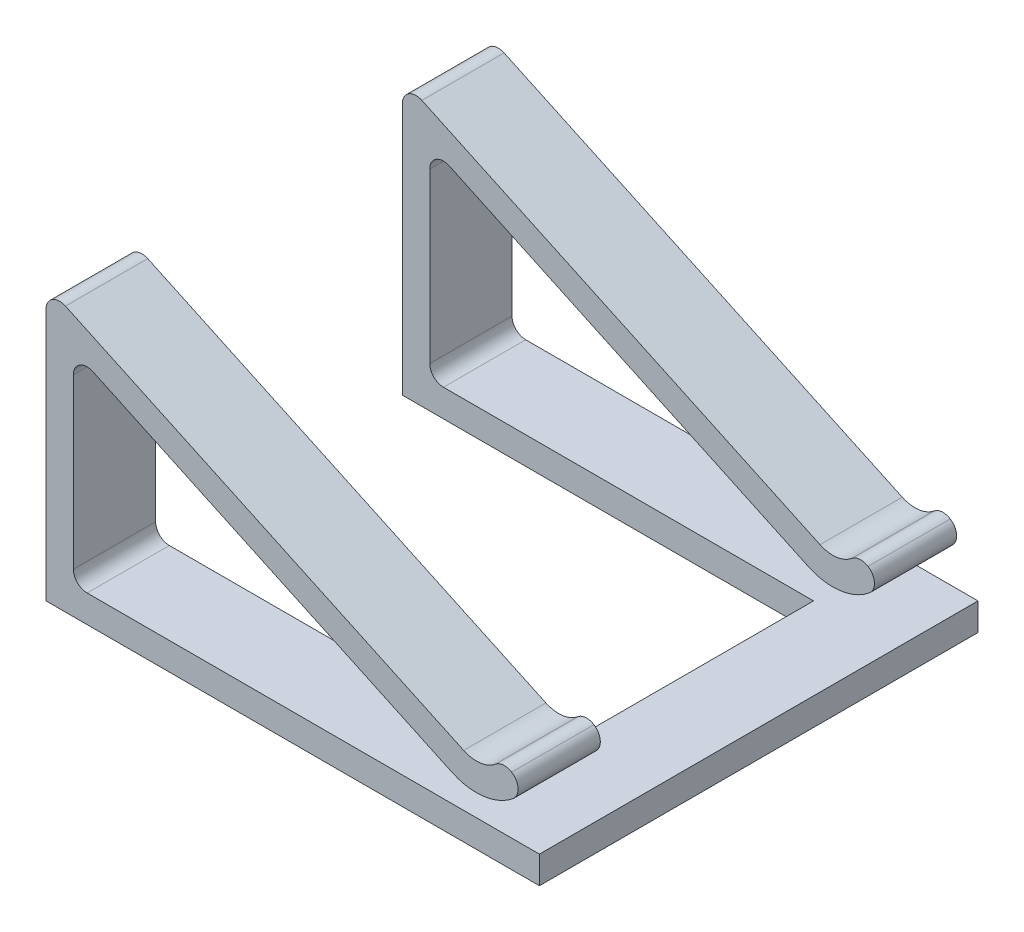
ISO-10303-21;
HEADER;
FILE_DESCRIPTION(('STEP AP214'),'2;1');
FILE_NAME('part.step','',(''),(''),'','','');
FILE_SCHEMA(('AUTOMOTIVE_DESIGN { 1 0 10303 214 1 1 1 1 }'));
ENDSEC;
DATA;
#1=APPLICATION_CONTEXT('core data for automotive mechanical design processes');
#2=APPLICATION_PROTOCOL_DEFINITION('international standard','automotive_design',2000,#1);
#3=PRODUCT_CONTEXT('',#1,'mechanical');
#4=PRODUCT('Part','Part','',(#3));
#5=PRODUCT_RELATED_PRODUCT_CATEGORY('part','',(#4));
#6=PRODUCT_DEFINITION_FORMATION('','',#4);
#7=PRODUCT_DEFINITION_CONTEXT('part definition',#1,'design');
#8=PRODUCT_DEFINITION('design','',#6,#7);
#9=PRODUCT_DEFINITION_SHAPE('','',#8);
#10=(LENGTH_UNIT() NAMED_UNIT(*) SI_UNIT(.MILLI.,.METRE.));
#11=(NAMED_UNIT(*) PLANE_ANGLE_UNIT() SI_UNIT($,.RADIAN.));
#12=(NAMED_UNIT(*) SI_UNIT($,.STERADIAN.) SOLID_ANGLE_UNIT());
#13=UNCERTAINTY_MEASURE_WITH_UNIT(LENGTH_MEASURE(1.E-05),#10,'distance_accuracy_value','');
#14=(GEOMETRIC_REPRESENTATION_CONTEXT(3) GLOBAL_UNCERTAINTY_ASSIGNED_CONTEXT((#13)) GLOBAL_UNIT_ASSIGNED_CONTEXT((#10,
#11,#12)) REPRESENTATION_CONTEXT('',''));
#15=CARTESIAN_POINT('',(0.,0.,0.));
#16=DIRECTION('',(0.,0.,1.));
#17=DIRECTION('',(1.,0.,0.));
#18=AXIS2_PLACEMENT_3D('',#15,#16,#17);
#19=CARTESIAN_POINT('',(150.,10.,-145.));
#20=DIRECTION('',(-1.,0.,0.));
#21=DIRECTION('',(0.,0.,1.));
#22=AXIS2_PLACEMENT_3D('',#19,#20,#21);
#23=PLANE('',#22);
#24=DIRECTION('',(0.,0.,1.));
#25=VECTOR('',#24,1.);
#26=CARTESIAN_POINT('',(150.,10.,-145.));
#27=LINE('',#26,#25);
#28=CARTESIAN_POINT('',(150.,10.,-115.));
#29=VERTEX_POINT('',#28);
#30=CARTESIAN_POINT('',(150.,10.,-15.));
#31=VERTEX_POINT('',#30);
#32=EDGE_CURVE('E327',#29,#31,#27,.T.);
#33=ORIENTED_EDGE('',*,*,#32,.F.);
#34=DIRECTION('',(0.,-1.,0.));
#35=VECTOR('',#34,1.);
#36=CARTESIAN_POINT('',(150.,10.,-115.));
#37=LINE('',#36,#35);
#38=CARTESIAN_POINT('',(150.,0.,-115.));
#39=VERTEX_POINT('',#38);
#40=EDGE_CURVE('E298',#29,#39,#37,.T.);
#41=ORIENTED_EDGE('',*,*,#40,.T.);
#42=DIRECTION('',(0.,0.,1.));
#43=VECTOR('',#42,1.);
#44=CARTESIAN_POINT('',(150.,0.,-145.));
#45=LINE('',#44,#43);
#46=CARTESIAN_POINT('',(150.,0.,-15.));
#47=VERTEX_POINT('',#46);
#48=EDGE_CURVE('E329',#39,#47,#45,.T.);
#49=ORIENTED_EDGE('',*,*,#48,.T.);
#50=DIRECTION('',(0.,-1.,0.));
#51=VECTOR('',#50,1.);
#52=CARTESIAN_POINT('',(150.,10.,-15.));
#53=LINE('',#52,#51);
#54=EDGE_CURVE('E393',#31,#47,#53,.T.);
#55=ORIENTED_EDGE('',*,*,#54,.F.);
#56=EDGE_LOOP('',(#33,#41,#49,#55));
#57=FACE_BOUND('',#56,.T.);
#58=ADVANCED_FACE('F42',(#57),#23,.T.);
#59=CARTESIAN_POINT('',(157.018492499117,38.9182315842951,15.));
#60=DIRECTION('',(0.,0.,-1.));
#61=DIRECTION('',(-1.,0.,0.));
#62=AXIS2_PLACEMENT_3D('',#59,#60,#61);
#63=CYLINDRICAL_SURFACE('',#62,21.);
#64=CARTESIAN_POINT('',(157.018492499117,38.9182315842951,-15.));
#65=DIRECTION('',(0.,0.,1.));
#66=DIRECTION('',(1.,0.,0.));
#67=AXIS2_PLACEMENT_3D('',#64,#65,#66);
#68=CIRCLE('',#67,21.);
#69=CARTESIAN_POINT('',(148.143509002562,19.8857680565255,-15.));
#70=VERTEX_POINT('',#69);
#71=CARTESIAN_POINT('',(170.412592532254,22.7442375104022,-15.));
#72=VERTEX_POINT('',#71);
#73=EDGE_CURVE('E332',#70,#72,#68,.T.);
#74=ORIENTED_EDGE('',*,*,#73,.T.);
#75=DIRECTION('',(0.,0.,-1.));
#76=VECTOR('',#75,1.);
#77=CARTESIAN_POINT('',(170.412592532254,22.7442375104022,15.));
#78=LINE('',#77,#76);
#79=CARTESIAN_POINT('',(170.412592532254,22.7442375104022,15.));
#80=VERTEX_POINT('',#79);
#81=EDGE_CURVE('E494',#72,#80,#78,.F.);
#82=ORIENTED_EDGE('',*,*,#81,.T.);
#83=CARTESIAN_POINT('',(157.018492499117,38.9182315842951,15.));
#84=DIRECTION('',(0.,0.,1.));
#85=DIRECTION('',(1.,0.,0.));
#86=AXIS2_PLACEMENT_3D('',#83,#84,#85);
#87=CIRCLE('',#86,21.);
#88=CARTESIAN_POINT('',(148.143509002562,19.8857680565255,15.));
#89=VERTEX_POINT('',#88);
#90=EDGE_CURVE('E345',#89,#80,#87,.T.);
#91=ORIENTED_EDGE('',*,*,#90,.F.);
#92=DIRECTION('',(0.,0.,-1.));
#93=VECTOR('',#92,1.);
#94=CARTESIAN_POINT('',(148.143509002562,19.8857680565255,15.));
#95=LINE('',#94,#93);
#96=EDGE_CURVE('E374',#89,#70,#95,.T.);
#97=ORIENTED_EDGE('',*,*,#96,.T.);
#98=EDGE_LOOP('',(#74,#82,#91,#97));
#99=FACE_BOUND('',#98,.T.);
#100=ADVANCED_FACE('F599',(#99),#63,.T.);
#101=CARTESIAN_POINT('',(157.018492499117,38.9182315842951,15.));
#102=DIRECTION('',(0.,0.,-1.));
#103=DIRECTION('',(-1.,0.,0.));
#104=AXIS2_PLACEMENT_3D('',#101,#102,#103);
#105=CYLINDRICAL_SURFACE('',#104,11.);
#106=CARTESIAN_POINT('',(157.018492499117,38.9182315842951,15.));
#107=DIRECTION('',(0.,0.,1.));
#108=DIRECTION('',(1.,0.,0.));
#109=AXIS2_PLACEMENT_3D('',#106,#107,#108);
#110=CIRCLE('',#109,11.);
#111=CARTESIAN_POINT('',(152.369691619969,28.948845926892,15.));
#112=VERTEX_POINT('',#111);
#113=CARTESIAN_POINT('',(164.034449659331,30.4461394503512,15.));
#114=VERTEX_POINT('',#113);
#115=EDGE_CURVE('E350',#112,#114,#110,.T.);
#116=ORIENTED_EDGE('',*,*,#115,.T.);
#117=DIRECTION('',(0.,0.,-1.));
#118=VECTOR('',#117,1.);
#119=CARTESIAN_POINT('',(164.034449659331,30.4461394503512,15.));
#120=LINE('',#119,#118);
#121=CARTESIAN_POINT('',(164.034449659331,30.4461394503512,-15.));
#122=VERTEX_POINT('',#121);
#123=EDGE_CURVE('E498',#114,#122,#120,.T.);
#124=ORIENTED_EDGE('',*,*,#123,.T.);
#125=CARTESIAN_POINT('',(157.018492499117,38.9182315842951,-15.));
#126=DIRECTION('',(0.,0.,1.));
#127=DIRECTION('',(1.,0.,0.));
#128=AXIS2_PLACEMENT_3D('',#125,#126,#127);
#129=CIRCLE('',#128,11.);
#130=CARTESIAN_POINT('',(152.369691619969,28.948845926892,-15.));
#131=VERTEX_POINT('',#130);
#132=EDGE_CURVE('E378',#131,#122,#129,.T.);
#133=ORIENTED_EDGE('',*,*,#132,.F.);
#134=DIRECTION('',(0.,0.,-1.));
#135=VECTOR('',#134,1.);
#136=CARTESIAN_POINT('',(152.369691619969,28.948845926892,15.));
#137=LINE('',#136,#135);
#138=EDGE_CURVE('E413',#112,#131,#137,.T.);
#139=ORIENTED_EDGE('',*,*,#138,.F.);
#140=EDGE_LOOP('',(#116,#124,#133,#139));
#141=FACE_BOUND('',#140,.T.);
#142=ADVANCED_FACE('F547',(#141),#105,.F.);
#143=CARTESIAN_POINT('',(0.,100.,15.));
#144=DIRECTION('',(0.422618261740704,0.906307787036648,0.));
#145=DIRECTION('',(-0.906307787036648,0.422618261740704,0.));
#146=AXIS2_PLACEMENT_3D('',#143,#144,#145);
#147=PLANE('',#146);
#148=DIRECTION('',(0.906307787036648,-0.422618261740704,0.));
#149=VECTOR('',#148,1.);
#150=CARTESIAN_POINT('',(0.,100.,-15.));
#151=LINE('',#150,#149);
#152=CARTESIAN_POINT('',(7.11309130870351,96.6831110495958,-15.));
#153=VERTEX_POINT('',#152);
#154=EDGE_CURVE('E384',#153,#131,#151,.T.);
#155=ORIENTED_EDGE('',*,*,#154,.F.);
#156=DIRECTION('',(0.,0.,-1.));
#157=VECTOR('',#156,1.);
#158=CARTESIAN_POINT('',(7.11309130870351,96.6831110495958,15.));
#159=LINE('',#158,#157);
#160=CARTESIAN_POINT('',(7.11309130870351,96.6831110495958,15.));
#161=VERTEX_POINT('',#160);
#162=EDGE_CURVE('E431',#153,#161,#159,.F.);
#163=ORIENTED_EDGE('',*,*,#162,.T.);
#164=DIRECTION('',(0.906307787036648,-0.422618261740704,0.));
#165=VECTOR('',#164,1.);
#166=CARTESIAN_POINT('',(0.,100.,15.));
#167=LINE('',#166,#165);
#168=EDGE_CURVE('E352',#161,#112,#167,.T.);
#169=ORIENTED_EDGE('',*,*,#168,.T.);
#170=ORIENTED_EDGE('',*,*,#138,.T.);
#171=EDGE_LOOP('',(#155,#163,#169,#170));
#172=FACE_BOUND('',#171,.T.);
#173=ADVANCED_FACE('F552',(#172),#147,.T.);
#174=CARTESIAN_POINT('',(0.,0.,15.));
#175=DIRECTION('',(-1.,0.,0.));
#176=DIRECTION('',(0.,0.,1.));
#177=AXIS2_PLACEMENT_3D('',#174,#175,#176);
#178=PLANE('',#177);
#179=DIRECTION('',(0.,1.,0.));
#180=VECTOR('',#179,1.);
#181=CARTESIAN_POINT('',(0.,0.,15.));
#182=LINE('',#181,#180);
#183=CARTESIAN_POINT('',(0.,0.,15.));
#184=VERTEX_POINT('',#183);
#185=CARTESIAN_POINT('',(0.,92.1515721144125,15.));
#186=VERTEX_POINT('',#185);
#187=EDGE_CURVE('E358',#184,#186,#182,.T.);
#188=ORIENTED_EDGE('',*,*,#187,.T.);
#189=DIRECTION('',(0.,0.,-1.));
#190=VECTOR('',#189,1.);
#191=CARTESIAN_POINT('',(0.,92.1515721144125,15.));
#192=LINE('',#191,#190);
#193=CARTESIAN_POINT('',(0.,92.1515721144125,-15.));
#194=VERTEX_POINT('',#193);
#195=EDGE_CURVE('E417',#186,#194,#192,.T.);
#196=ORIENTED_EDGE('',*,*,#195,.T.);
#197=DIRECTION('',(0.,1.,0.));
#198=VECTOR('',#197,1.);
#199=CARTESIAN_POINT('',(0.,0.,-15.));
#200=LINE('',#199,#198);
#201=CARTESIAN_POINT('',(0.,0.,-15.));
#202=VERTEX_POINT('',#201);
#203=EDGE_CURVE('E388',#202,#194,#200,.T.);
#204=ORIENTED_EDGE('',*,*,#203,.F.);
#205=DIRECTION('',(0.,0.,-1.));
#206=VECTOR('',#205,1.);
#207=CARTESIAN_POINT('',(0.,0.,15.));
#208=LINE('',#207,#206);
#209=EDGE_CURVE('E414',#184,#202,#208,.T.);
#210=ORIENTED_EDGE('',*,*,#209,.F.);
#211=EDGE_LOOP('',(#188,#196,#204,#210));
#212=FACE_BOUND('',#211,.T.);
#213=ADVANCED_FACE('F561',(#212),#178,.T.);
#214=CARTESIAN_POINT('',(0.,0.,15.));
#215=DIRECTION('',(0.,-1.,0.));
#216=DIRECTION('',(0.,0.,-1.));
#217=AXIS2_PLACEMENT_3D('',#214,#215,#216);
#218=PLANE('',#217);
#219=DIRECTION('',(-1.,0.,0.));
#220=VECTOR('',#219,1.);
#221=CARTESIAN_POINT('',(0.,0.,-15.));
#222=LINE('',#221,#220);
#223=EDGE_CURVE('E386',#47,#202,#222,.T.);
#224=ORIENTED_EDGE('',*,*,#223,.F.);
#225=ORIENTED_EDGE('',*,*,#48,.F.);
#226=DIRECTION('',(-1.,0.,0.));
#227=VECTOR('',#226,1.);
#228=CARTESIAN_POINT('',(0.,0.,-115.));
#229=LINE('',#228,#227);
#230=CARTESIAN_POINT('',(0.,0.,-115.));
#231=VERTEX_POINT('',#230);
#232=EDGE_CURVE('E297',#39,#231,#229,.T.);
#233=ORIENTED_EDGE('',*,*,#232,.T.);
#234=DIRECTION('',(0.,0.,1.));
#235=VECTOR('',#234,1.);
#236=CARTESIAN_POINT('',(0.,0.,-145.));
#237=LINE('',#236,#235);
#238=CARTESIAN_POINT('',(0.,0.,-145.));
#239=VERTEX_POINT('',#238);
#240=EDGE_CURVE('E251',#239,#231,#237,.T.);
#241=ORIENTED_EDGE('',*,*,#240,.F.);
#242=DIRECTION('',(1.,0.,0.));
#243=VECTOR('',#242,1.);
#244=CARTESIAN_POINT('',(180.,0.,-145.));
#245=LINE('',#244,#243);
#246=CARTESIAN_POINT('',(180.,0.,-145.));
#247=VERTEX_POINT('',#246);
#248=EDGE_CURVE('E314',#239,#247,#245,.T.);
#249=ORIENTED_EDGE('',*,*,#248,.T.);
#250=DIRECTION('',(0.,0.,1.));
#251=VECTOR('',#250,1.);
#252=CARTESIAN_POINT('',(180.,0.,-145.));
#253=LINE('',#252,#251);
#254=CARTESIAN_POINT('',(180.,0.,15.));
#255=VERTEX_POINT('',#254);
#256=EDGE_CURVE('E336',#247,#255,#253,.T.);
#257=ORIENTED_EDGE('',*,*,#256,.T.);
#258=DIRECTION('',(-1.,0.,0.));
#259=VECTOR('',#258,1.);
#260=CARTESIAN_POINT('',(0.,0.,15.));
#261=LINE('',#260,#259);
#262=EDGE_CURVE('E359',#255,#184,#261,.T.);
#263=ORIENTED_EDGE('',*,*,#262,.T.);
#264=ORIENTED_EDGE('',*,*,#209,.T.);
#265=EDGE_LOOP('',(#224,#225,#233,#241,#249,#257,#263,#264));
#266=FACE_BOUND('',#265,.T.);
#267=ADVANCED_FACE('F567',(#266),#218,.T.);
#268=CARTESIAN_POINT('',(0.,10.,15.));
#269=DIRECTION('',(0.,-1.,0.));
#270=DIRECTION('',(0.,0.,-1.));
#271=AXIS2_PLACEMENT_3D('',#268,#269,#270);
#272=PLANE('',#271);
#273=DIRECTION('',(-1.,0.,0.));
#274=VECTOR('',#273,1.);
#275=CARTESIAN_POINT('',(150.,10.,-145.));
#276=LINE('',#275,#274);
#277=CARTESIAN_POINT('',(180.,10.,-145.));
#278=VERTEX_POINT('',#277);
#279=CARTESIAN_POINT('',(15.,10.,-145.));
#280=VERTEX_POINT('',#279);
#281=EDGE_CURVE('E322',#278,#280,#276,.T.);
#282=ORIENTED_EDGE('',*,*,#281,.T.);
#283=DIRECTION('',(0.,0.,1.));
#284=VECTOR('',#283,1.);
#285=CARTESIAN_POINT('',(15.,10.,15.));
#286=LINE('',#285,#284);
#287=CARTESIAN_POINT('',(15.,10.,-115.));
#288=VERTEX_POINT('',#287);
#289=EDGE_CURVE('E479',#280,#288,#286,.T.);
#290=ORIENTED_EDGE('',*,*,#289,.T.);
#291=DIRECTION('',(1.,0.,0.));
#292=VECTOR('',#291,1.);
#293=CARTESIAN_POINT('',(0.,10.,-115.));
#294=LINE('',#293,#292);
#295=EDGE_CURVE('E292',#29,#288,#294,.F.);
#296=ORIENTED_EDGE('',*,*,#295,.F.);
#297=ORIENTED_EDGE('',*,*,#32,.T.);
#298=DIRECTION('',(1.,0.,0.));
#299=VECTOR('',#298,1.);
#300=CARTESIAN_POINT('',(0.,10.,-15.));
#301=LINE('',#300,#299);
#302=CARTESIAN_POINT('',(15.,10.,-15.));
#303=VERTEX_POINT('',#302);
#304=EDGE_CURVE('E397',#31,#303,#301,.F.);
#305=ORIENTED_EDGE('',*,*,#304,.T.);
#306=DIRECTION('',(0.,0.,-1.));
#307=VECTOR('',#306,1.);
#308=CARTESIAN_POINT('',(15.,10.,15.));
#309=LINE('',#308,#307);
#310=CARTESIAN_POINT('',(15.,10.,15.));
#311=VERTEX_POINT('',#310);
#312=EDGE_CURVE('E472',#303,#311,#309,.F.);
#313=ORIENTED_EDGE('',*,*,#312,.T.);
#314=DIRECTION('',(1.,0.,0.));
#315=VECTOR('',#314,1.);
#316=CARTESIAN_POINT('',(0.,10.,15.));
#317=LINE('',#316,#315);
#318=CARTESIAN_POINT('',(180.,10.,15.));
#319=VERTEX_POINT('',#318);
#320=EDGE_CURVE('E364',#319,#311,#317,.F.);
#321=ORIENTED_EDGE('',*,*,#320,.F.);
#322=DIRECTION('',(0.,0.,1.));
#323=VECTOR('',#322,1.);
#324=CARTESIAN_POINT('',(180.,10.,-145.));
#325=LINE('',#324,#323);
#326=EDGE_CURVE('E335',#278,#319,#325,.T.);
#327=ORIENTED_EDGE('',*,*,#326,.F.);
#328=EDGE_LOOP('',(#282,#290,#296,#297,#305,#313,#321,#327));
#329=FACE_BOUND('',#328,.T.);
#330=ADVANCED_FACE('F577',(#329),#272,.F.);
#331=CARTESIAN_POINT('',(10.,0.,15.));
#332=DIRECTION('',(-1.,0.,0.));
#333=DIRECTION('',(0.,0.,1.));
#334=AXIS2_PLACEMENT_3D('',#331,#332,#333);
#335=PLANE('',#334);
#336=DIRECTION('',(0.,1.,0.));
#337=VECTOR('',#336,1.);
#338=CARTESIAN_POINT('',(10.,0.,15.));
#339=LINE('',#338,#337);
#340=CARTESIAN_POINT('',(10.,15.,15.));
#341=VERTEX_POINT('',#340);
#342=CARTESIAN_POINT('',(10.,76.4547163432375,15.));
#343=VERTEX_POINT('',#342);
#344=EDGE_CURVE('E368',#341,#343,#339,.T.);
#345=ORIENTED_EDGE('',*,*,#344,.F.);
#346=DIRECTION('',(0.,0.,-1.));
#347=VECTOR('',#346,1.);
#348=CARTESIAN_POINT('',(10.,15.,-15.));
#349=LINE('',#348,#347);
#350=CARTESIAN_POINT('',(10.,15.,-15.));
#351=VERTEX_POINT('',#350);
#352=EDGE_CURVE('E489',#341,#351,#349,.T.);
#353=ORIENTED_EDGE('',*,*,#352,.T.);
#354=DIRECTION('',(0.,1.,0.));
#355=VECTOR('',#354,1.);
#356=CARTESIAN_POINT('',(10.,0.,-15.));
#357=LINE('',#356,#355);
#358=CARTESIAN_POINT('',(10.,76.4547163432375,-15.));
#359=VERTEX_POINT('',#358);
#360=EDGE_CURVE('E405',#351,#359,#357,.T.);
#361=ORIENTED_EDGE('',*,*,#360,.T.);
#362=DIRECTION('',(0.,0.,-1.));
#363=VECTOR('',#362,1.);
#364=CARTESIAN_POINT('',(10.,76.4547163432375,15.));
#365=LINE('',#364,#363);
#366=EDGE_CURVE('E487',#359,#343,#365,.F.);
#367=ORIENTED_EDGE('',*,*,#366,.T.);
#368=EDGE_LOOP('',(#345,#353,#361,#367));
#369=FACE_BOUND('',#368,.T.);
#370=ADVANCED_FACE('F589',(#369),#335,.F.);
#371=CARTESIAN_POINT('',(-4.22618261740704,90.9369221296335,15.));
#372=DIRECTION('',(0.422618261740704,0.906307787036648,0.));
#373=DIRECTION('',(-0.906307787036648,0.422618261740704,0.));
#374=AXIS2_PLACEMENT_3D('',#371,#372,#373);
#375=PLANE('',#374);
#376=DIRECTION('',(0.906307787036648,-0.422618261740704,0.));
#377=VECTOR('',#376,1.);
#378=CARTESIAN_POINT('',(-4.22618261740704,90.9369221296335,15.));
#379=LINE('',#378,#377);
#380=CARTESIAN_POINT('',(17.1130913087035,80.9862552784208,15.));
#381=VERTEX_POINT('',#380);
#382=EDGE_CURVE('E375',#381,#89,#379,.T.);
#383=ORIENTED_EDGE('',*,*,#382,.F.);
#384=DIRECTION('',(0.,0.,-1.));
#385=VECTOR('',#384,1.);
#386=CARTESIAN_POINT('',(17.1130913087035,80.9862552784208,-15.));
#387=LINE('',#386,#385);
#388=CARTESIAN_POINT('',(17.1130913087035,80.9862552784208,-15.));
#389=VERTEX_POINT('',#388);
#390=EDGE_CURVE('E503',#381,#389,#387,.T.);
#391=ORIENTED_EDGE('',*,*,#390,.T.);
#392=DIRECTION('',(0.906307787036648,-0.422618261740704,0.));
#393=VECTOR('',#392,1.);
#394=CARTESIAN_POINT('',(-4.22618261740704,90.9369221296335,-15.));
#395=LINE('',#394,#393);
#396=EDGE_CURVE('E348',#389,#70,#395,.T.);
#397=ORIENTED_EDGE('',*,*,#396,.T.);
#398=ORIENTED_EDGE('',*,*,#96,.F.);
#399=EDGE_LOOP('',(#383,#391,#397,#398));
#400=FACE_BOUND('',#399,.T.);
#401=ADVANCED_FACE('F591',(#400),#375,.F.);
#402=CARTESIAN_POINT('',(157.018492499117,38.9182315842951,15.));
#403=DIRECTION('',(0.,0.,1.));
#404=DIRECTION('',(1.,0.,0.));
#405=AXIS2_PLACEMENT_3D('',#402,#403,#404);
#406=PLANE('',#405);
#407=ORIENTED_EDGE('',*,*,#168,.F.);
#408=CARTESIAN_POINT('',(5.,92.1515721144125,15.));
#409=DIRECTION('',(0.,0.,1.));
#410=DIRECTION('',(1.,0.,0.));
#411=AXIS2_PLACEMENT_3D('',#408,#409,#410);
#412=CIRCLE('',#411,5.);
#413=EDGE_CURVE('E439',#161,#186,#412,.T.);
#414=ORIENTED_EDGE('',*,*,#413,.T.);
#415=ORIENTED_EDGE('',*,*,#187,.F.);
#416=ORIENTED_EDGE('',*,*,#262,.F.);
#417=DIRECTION('',(0.,1.,0.));
#418=VECTOR('',#417,1.);
#419=CARTESIAN_POINT('',(180.,10.,15.));
#420=LINE('',#419,#418);
#421=EDGE_CURVE('E254',#255,#319,#420,.T.);
#422=ORIENTED_EDGE('',*,*,#421,.T.);
#423=ORIENTED_EDGE('',*,*,#320,.T.);
#424=CARTESIAN_POINT('',(15.,15.,15.));
#425=DIRECTION('',(0.,0.,1.));
#426=DIRECTION('',(1.,0.,0.));
#427=AXIS2_PLACEMENT_3D('',#424,#425,#426);
#428=CIRCLE('',#427,5.);
#429=EDGE_CURVE('E513',#311,#341,#428,.F.);
#430=ORIENTED_EDGE('',*,*,#429,.T.);
#431=ORIENTED_EDGE('',*,*,#344,.T.);
#432=CARTESIAN_POINT('',(15.,76.4547163432375,15.));
#433=DIRECTION('',(0.,0.,1.));
#434=DIRECTION('',(1.,0.,0.));
#435=AXIS2_PLACEMENT_3D('',#432,#433,#434);
#436=CIRCLE('',#435,5.);
#437=EDGE_CURVE('E11',#343,#381,#436,.F.);
#438=ORIENTED_EDGE('',*,*,#437,.T.);
#439=ORIENTED_EDGE('',*,*,#382,.T.);
#440=ORIENTED_EDGE('',*,*,#90,.T.);
#441=CARTESIAN_POINT('',(167.223521095793,26.5951884803767,15.));
#442=DIRECTION('',(0.,0.,1.));
#443=DIRECTION('',(1.,0.,0.));
#444=AXIS2_PLACEMENT_3D('',#441,#442,#443);
#445=CIRCLE('',#444,5.);
#446=CARTESIAN_POINT('',(169.885022989619,30.8279662526154,15.));
#447=VERTEX_POINT('',#446);
#448=EDGE_CURVE('E440',#80,#447,#445,.T.);
#449=ORIENTED_EDGE('',*,*,#448,.T.);
#450=CARTESIAN_POINT('',(167.223521095793,26.5951884803767,15.));
#451=DIRECTION('',(0.,0.,1.));
#452=DIRECTION('',(1.,0.,0.));
#453=AXIS2_PLACEMENT_3D('',#450,#451,#452);
#454=CIRCLE('',#453,5.);
#455=EDGE_CURVE('E432',#447,#114,#454,.T.);
#456=ORIENTED_EDGE('',*,*,#455,.T.);
#457=ORIENTED_EDGE('',*,*,#115,.F.);
#458=EDGE_LOOP('',(#407,#414,#415,#416,#422,#423,#430,#431,#438,#439,#440,#449,#456,#457));
#459=FACE_BOUND('',#458,.T.);
#460=ADVANCED_FACE('F542',(#459),#406,.T.);
#461=CARTESIAN_POINT('',(157.018492499117,38.9182315842951,-15.));
#462=DIRECTION('',(0.,0.,1.));
#463=DIRECTION('',(1.,0.,0.));
#464=AXIS2_PLACEMENT_3D('',#461,#462,#463);
#465=PLANE('',#464);
#466=ORIENTED_EDGE('',*,*,#203,.T.);
#467=CARTESIAN_POINT('',(5.,92.1515721144125,-15.));
#468=DIRECTION('',(0.,0.,1.));
#469=DIRECTION('',(1.,0.,0.));
#470=AXIS2_PLACEMENT_3D('',#467,#468,#469);
#471=CIRCLE('',#470,5.);
#472=EDGE_CURVE('E426',#194,#153,#471,.F.);
#473=ORIENTED_EDGE('',*,*,#472,.T.);
#474=ORIENTED_EDGE('',*,*,#154,.T.);
#475=ORIENTED_EDGE('',*,*,#132,.T.);
#476=CARTESIAN_POINT('',(167.223521095793,26.5951884803767,-15.));
#477=DIRECTION('',(0.,0.,1.));
#478=DIRECTION('',(1.,0.,0.));
#479=AXIS2_PLACEMENT_3D('',#476,#477,#478);
#480=CIRCLE('',#479,5.);
#481=CARTESIAN_POINT('',(169.885022989619,30.8279662526154,-15.));
#482=VERTEX_POINT('',#481);
#483=EDGE_CURVE('E422',#122,#482,#480,.F.);
#484=ORIENTED_EDGE('',*,*,#483,.T.);
#485=CARTESIAN_POINT('',(167.223521095793,26.5951884803767,-15.));
#486=DIRECTION('',(0.,0.,1.));
#487=DIRECTION('',(1.,0.,0.));
#488=AXIS2_PLACEMENT_3D('',#485,#486,#487);
#489=CIRCLE('',#488,5.);
#490=EDGE_CURVE('E424',#482,#72,#489,.F.);
#491=ORIENTED_EDGE('',*,*,#490,.T.);
#492=ORIENTED_EDGE('',*,*,#73,.F.);
#493=ORIENTED_EDGE('',*,*,#396,.F.);
#494=CARTESIAN_POINT('',(15.,76.4547163432375,-15.));
#495=DIRECTION('',(0.,0.,1.));
#496=DIRECTION('',(1.,0.,0.));
#497=AXIS2_PLACEMENT_3D('',#494,#495,#496);
#498=CIRCLE('',#497,5.);
#499=EDGE_CURVE('E53',#389,#359,#498,.T.);
#500=ORIENTED_EDGE('',*,*,#499,.T.);
#501=ORIENTED_EDGE('',*,*,#360,.F.);
#502=CARTESIAN_POINT('',(15.,15.,-15.));
#503=DIRECTION('',(0.,0.,1.));
#504=DIRECTION('',(1.,0.,0.));
#505=AXIS2_PLACEMENT_3D('',#502,#503,#504);
#506=CIRCLE('',#505,5.);
#507=EDGE_CURVE('E515',#351,#303,#506,.T.);
#508=ORIENTED_EDGE('',*,*,#507,.T.);
#509=ORIENTED_EDGE('',*,*,#304,.F.);
#510=ORIENTED_EDGE('',*,*,#54,.T.);
#511=ORIENTED_EDGE('',*,*,#223,.T.);
#512=EDGE_LOOP('',(#466,#473,#474,#475,#484,#491,#492,#493,#500,#501,#508,#509,#510,#511));
#513=FACE_BOUND('',#512,.T.);
#514=ADVANCED_FACE('F563',(#513),#465,.F.);
#515=CARTESIAN_POINT('',(180.,10.,-145.));
#516=DIRECTION('',(1.,0.,0.));
#517=DIRECTION('',(0.,0.,-1.));
#518=AXIS2_PLACEMENT_3D('',#515,#516,#517);
#519=PLANE('',#518);
#520=ORIENTED_EDGE('',*,*,#421,.F.);
#521=ORIENTED_EDGE('',*,*,#256,.F.);
#522=DIRECTION('',(0.,1.,0.));
#523=VECTOR('',#522,1.);
#524=CARTESIAN_POINT('',(180.,10.,-145.));
#525=LINE('',#524,#523);
#526=EDGE_CURVE('E316',#247,#278,#525,.T.);
#527=ORIENTED_EDGE('',*,*,#526,.T.);
#528=ORIENTED_EDGE('',*,*,#326,.T.);
#529=EDGE_LOOP('',(#520,#521,#527,#528));
#530=FACE_BOUND('',#529,.T.);
#531=ADVANCED_FACE('F573',(#530),#519,.T.);
#532=CARTESIAN_POINT('',(0.,0.,-145.));
#533=DIRECTION('',(0.,0.,-1.));
#534=DIRECTION('',(-1.,0.,0.));
#535=AXIS2_PLACEMENT_3D('',#532,#533,#534);
#536=PLANE('',#535);
#537=DIRECTION('',(0.,1.,0.));
#538=VECTOR('',#537,1.);
#539=CARTESIAN_POINT('',(0.,0.,-145.));
#540=LINE('',#539,#538);
#541=CARTESIAN_POINT('',(0.,92.1515721144125,-145.));
#542=VERTEX_POINT('',#541);
#543=EDGE_CURVE('E272',#239,#542,#540,.T.);
#544=ORIENTED_EDGE('',*,*,#543,.T.);
#545=CARTESIAN_POINT('',(5.,92.1515721144125,-145.));
#546=DIRECTION('',(0.,0.,-1.));
#547=DIRECTION('',(-1.,0.,0.));
#548=AXIS2_PLACEMENT_3D('',#545,#546,#547);
#549=CIRCLE('',#548,5.);
#550=CARTESIAN_POINT('',(7.11309130870351,96.6831110495958,-145.));
#551=VERTEX_POINT('',#550);
#552=EDGE_CURVE('E465',#542,#551,#549,.T.);
#553=ORIENTED_EDGE('',*,*,#552,.T.);
#554=DIRECTION('',(0.906307787036648,-0.422618261740704,0.));
#555=VECTOR('',#554,1.);
#556=CARTESIAN_POINT('',(0.,100.,-145.));
#557=LINE('',#556,#555);
#558=CARTESIAN_POINT('',(152.369691619969,28.948845926892,-145.));
#559=VERTEX_POINT('',#558);
#560=EDGE_CURVE('E274',#551,#559,#557,.T.);
#561=ORIENTED_EDGE('',*,*,#560,.T.);
#562=CARTESIAN_POINT('',(157.018492499117,38.9182315842951,-145.));
#563=DIRECTION('',(0.,0.,1.));
#564=DIRECTION('',(1.,0.,0.));
#565=AXIS2_PLACEMENT_3D('',#562,#563,#564);
#566=CIRCLE('',#565,11.);
#567=CARTESIAN_POINT('',(164.034449659331,30.4461394503512,-145.));
#568=VERTEX_POINT('',#567);
#569=EDGE_CURVE('E279',#559,#568,#566,.T.);
#570=ORIENTED_EDGE('',*,*,#569,.T.);
#571=CARTESIAN_POINT('',(167.223521095793,26.5951884803767,-145.));
#572=DIRECTION('',(0.,0.,-1.));
#573=DIRECTION('',(-1.,0.,0.));
#574=AXIS2_PLACEMENT_3D('',#571,#572,#573);
#575=CIRCLE('',#574,5.);
#576=CARTESIAN_POINT('',(169.885022989619,30.8279662526154,-145.));
#577=VERTEX_POINT('',#576);
#578=EDGE_CURVE('E458',#568,#577,#575,.T.);
#579=ORIENTED_EDGE('',*,*,#578,.T.);
#580=CARTESIAN_POINT('',(167.223521095793,26.5951884803767,-145.));
#581=DIRECTION('',(0.,0.,-1.));
#582=DIRECTION('',(-1.,0.,0.));
#583=AXIS2_PLACEMENT_3D('',#580,#581,#582);
#584=CIRCLE('',#583,5.);
#585=CARTESIAN_POINT('',(170.412592532254,22.7442375104022,-145.));
#586=VERTEX_POINT('',#585);
#587=EDGE_CURVE('E260',#577,#586,#584,.T.);
#588=ORIENTED_EDGE('',*,*,#587,.T.);
#589=CARTESIAN_POINT('',(157.018492499117,38.9182315842951,-145.));
#590=DIRECTION('',(0.,0.,1.));
#591=DIRECTION('',(1.,0.,0.));
#592=AXIS2_PLACEMENT_3D('',#589,#590,#591);
#593=CIRCLE('',#592,21.);
#594=CARTESIAN_POINT('',(148.143509002562,19.8857680565255,-145.));
#595=VERTEX_POINT('',#594);
#596=EDGE_CURVE('E243',#595,#586,#593,.T.);
#597=ORIENTED_EDGE('',*,*,#596,.F.);
#598=DIRECTION('',(0.906307787036648,-0.422618261740704,0.));
#599=VECTOR('',#598,1.);
#600=CARTESIAN_POINT('',(-4.22618261740704,90.9369221296335,-145.));
#601=LINE('',#600,#599);
#602=CARTESIAN_POINT('',(17.1130913087035,80.9862552784208,-145.));
#603=VERTEX_POINT('',#602);
#604=EDGE_CURVE('E235',#603,#595,#601,.T.);
#605=ORIENTED_EDGE('',*,*,#604,.F.);
#606=CARTESIAN_POINT('',(15.,76.4547163432375,-145.));
#607=DIRECTION('',(0.,0.,-1.));
#608=DIRECTION('',(-1.,0.,0.));
#609=AXIS2_PLACEMENT_3D('',#606,#607,#608);
#610=CIRCLE('',#609,5.);
#611=CARTESIAN_POINT('',(10.,76.4547163432375,-145.));
#612=VERTEX_POINT('',#611);
#613=EDGE_CURVE('E70',#603,#612,#610,.F.);
#614=ORIENTED_EDGE('',*,*,#613,.T.);
#615=DIRECTION('',(0.,1.,0.));
#616=VECTOR('',#615,1.);
#617=CARTESIAN_POINT('',(10.,0.,-145.));
#618=LINE('',#617,#616);
#619=CARTESIAN_POINT('',(10.,15.,-145.));
#620=VERTEX_POINT('',#619);
#621=EDGE_CURVE('E245',#620,#612,#618,.T.);
#622=ORIENTED_EDGE('',*,*,#621,.F.);
#623=CARTESIAN_POINT('',(15.,15.,-145.));
#624=DIRECTION('',(0.,0.,-1.));
#625=DIRECTION('',(-1.,0.,0.));
#626=AXIS2_PLACEMENT_3D('',#623,#624,#625);
#627=CIRCLE('',#626,5.);
#628=EDGE_CURVE('E64',#620,#280,#627,.F.);
#629=ORIENTED_EDGE('',*,*,#628,.T.);
#630=ORIENTED_EDGE('',*,*,#281,.F.);
#631=ORIENTED_EDGE('',*,*,#526,.F.);
#632=ORIENTED_EDGE('',*,*,#248,.F.);
#633=EDGE_LOOP('',(#544,#553,#561,#570,#579,#588,#597,#605,#614,#622,#629,#630,#631,#632));
#634=FACE_BOUND('',#633,.T.);
#635=ADVANCED_FACE('F259',(#634),#536,.T.);
#636=CARTESIAN_POINT('',(157.018492499117,38.9182315842951,-145.));
#637=DIRECTION('',(0.,0.,1.));
#638=DIRECTION('',(1.,0.,0.));
#639=AXIS2_PLACEMENT_3D('',#636,#637,#638);
#640=CYLINDRICAL_SURFACE('',#639,21.);
#641=ORIENTED_EDGE('',*,*,#596,.T.);
#642=DIRECTION('',(0.,0.,1.));
#643=VECTOR('',#642,1.);
#644=CARTESIAN_POINT('',(170.412592532254,22.7442375104022,-145.));
#645=LINE('',#644,#643);
#646=CARTESIAN_POINT('',(170.412592532254,22.7442375104022,-115.));
#647=VERTEX_POINT('',#646);
#648=EDGE_CURVE('E470',#586,#647,#645,.T.);
#649=ORIENTED_EDGE('',*,*,#648,.T.);
#650=CARTESIAN_POINT('',(157.018492499117,38.9182315842951,-115.));
#651=DIRECTION('',(0.,0.,1.));
#652=DIRECTION('',(1.,0.,0.));
#653=AXIS2_PLACEMENT_3D('',#650,#651,#652);
#654=CIRCLE('',#653,21.);
#655=CARTESIAN_POINT('',(148.143509002562,19.8857680565255,-115.));
#656=VERTEX_POINT('',#655);
#657=EDGE_CURVE('E252',#656,#647,#654,.T.);
#658=ORIENTED_EDGE('',*,*,#657,.F.);
#659=DIRECTION('',(0.,0.,1.));
#660=VECTOR('',#659,1.);
#661=CARTESIAN_POINT('',(148.143509002562,19.8857680565255,-145.));
#662=LINE('',#661,#660);
#663=EDGE_CURVE('E236',#595,#656,#662,.T.);
#664=ORIENTED_EDGE('',*,*,#663,.F.);
#665=EDGE_LOOP('',(#641,#649,#658,#664));
#666=FACE_BOUND('',#665,.T.);
#667=ADVANCED_FACE('F250',(#666),#640,.T.);
#668=CARTESIAN_POINT('',(-4.22618261740704,90.9369221296335,-145.));
#669=DIRECTION('',(-0.422618261740704,-0.906307787036648,0.));
#670=DIRECTION('',(0.906307787036648,-0.422618261740704,0.));
#671=AXIS2_PLACEMENT_3D('',#668,#669,#670);
#672=PLANE('',#671);
#673=DIRECTION('',(0.906307787036648,-0.422618261740704,0.));
#674=VECTOR('',#673,1.);
#675=CARTESIAN_POINT('',(-4.22618261740704,90.9369221296335,-115.));
#676=LINE('',#675,#674);
#677=CARTESIAN_POINT('',(17.1130913087035,80.9862552784208,-115.));
#678=VERTEX_POINT('',#677);
#679=EDGE_CURVE('E283',#678,#656,#676,.T.);
#680=ORIENTED_EDGE('',*,*,#679,.F.);
#681=DIRECTION('',(0.,0.,1.));
#682=VECTOR('',#681,1.);
#683=CARTESIAN_POINT('',(17.1130913087035,80.9862552784208,-145.));
#684=LINE('',#683,#682);
#685=EDGE_CURVE('E237',#678,#603,#684,.F.);
#686=ORIENTED_EDGE('',*,*,#685,.T.);
#687=ORIENTED_EDGE('',*,*,#604,.T.);
#688=ORIENTED_EDGE('',*,*,#663,.T.);
#689=EDGE_LOOP('',(#680,#686,#687,#688));
#690=FACE_BOUND('',#689,.T.);
#691=ADVANCED_FACE('F232',(#690),#672,.T.);
#692=CARTESIAN_POINT('',(10.,0.,-145.));
#693=DIRECTION('',(1.,0.,0.));
#694=DIRECTION('',(0.,0.,-1.));
#695=AXIS2_PLACEMENT_3D('',#692,#693,#694);
#696=PLANE('',#695);
#697=DIRECTION('',(0.,1.,0.));
#698=VECTOR('',#697,1.);
#699=CARTESIAN_POINT('',(10.,0.,-115.));
#700=LINE('',#699,#698);
#701=CARTESIAN_POINT('',(10.,15.,-115.));
#702=VERTEX_POINT('',#701);
#703=CARTESIAN_POINT('',(10.,76.4547163432375,-115.));
#704=VERTEX_POINT('',#703);
#705=EDGE_CURVE('E287',#702,#704,#700,.T.);
#706=ORIENTED_EDGE('',*,*,#705,.F.);
#707=DIRECTION('',(0.,0.,1.));
#708=VECTOR('',#707,1.);
#709=CARTESIAN_POINT('',(10.,15.,-145.));
#710=LINE('',#709,#708);
#711=EDGE_CURVE('E485',#702,#620,#710,.F.);
#712=ORIENTED_EDGE('',*,*,#711,.T.);
#713=ORIENTED_EDGE('',*,*,#621,.T.);
#714=DIRECTION('',(0.,0.,1.));
#715=VECTOR('',#714,1.);
#716=CARTESIAN_POINT('',(10.,76.4547163432375,-115.));
#717=LINE('',#716,#715);
#718=EDGE_CURVE('E477',#612,#704,#717,.T.);
#719=ORIENTED_EDGE('',*,*,#718,.T.);
#720=EDGE_LOOP('',(#706,#712,#713,#719));
#721=FACE_BOUND('',#720,.T.);
#722=ADVANCED_FACE('F641',(#721),#696,.T.);
#723=CARTESIAN_POINT('',(0.,0.,-145.));
#724=DIRECTION('',(1.,0.,0.));
#725=DIRECTION('',(0.,0.,-1.));
#726=AXIS2_PLACEMENT_3D('',#723,#724,#725);
#727=PLANE('',#726);
#728=DIRECTION('',(0.,1.,0.));
#729=VECTOR('',#728,1.);
#730=CARTESIAN_POINT('',(0.,0.,-115.));
#731=LINE('',#730,#729);
#732=CARTESIAN_POINT('',(0.,92.1515721144125,-115.));
#733=VERTEX_POINT('',#732);
#734=EDGE_CURVE('E303',#231,#733,#731,.T.);
#735=ORIENTED_EDGE('',*,*,#734,.T.);
#736=DIRECTION('',(0.,0.,1.));
#737=VECTOR('',#736,1.);
#738=CARTESIAN_POINT('',(0.,92.1515721144125,-145.));
#739=LINE('',#738,#737);
#740=EDGE_CURVE('E459',#733,#542,#739,.F.);
#741=ORIENTED_EDGE('',*,*,#740,.T.);
#742=ORIENTED_EDGE('',*,*,#543,.F.);
#743=ORIENTED_EDGE('',*,*,#240,.T.);
#744=EDGE_LOOP('',(#735,#741,#742,#743));
#745=FACE_BOUND('',#744,.T.);
#746=ADVANCED_FACE('F655',(#745),#727,.F.);
#747=CARTESIAN_POINT('',(0.,100.,-145.));
#748=DIRECTION('',(-0.422618261740704,-0.906307787036648,0.));
#749=DIRECTION('',(0.906307787036648,-0.422618261740704,0.));
#750=AXIS2_PLACEMENT_3D('',#747,#748,#749);
#751=PLANE('',#750);
#752=ORIENTED_EDGE('',*,*,#560,.F.);
#753=DIRECTION('',(0.,0.,1.));
#754=VECTOR('',#753,1.);
#755=CARTESIAN_POINT('',(7.11309130870351,96.6831110495958,-145.));
#756=LINE('',#755,#754);
#757=CARTESIAN_POINT('',(7.11309130870351,96.6831110495958,-115.));
#758=VERTEX_POINT('',#757);
#759=EDGE_CURVE('E442',#551,#758,#756,.T.);
#760=ORIENTED_EDGE('',*,*,#759,.T.);
#761=DIRECTION('',(0.906307787036648,-0.422618261740704,0.));
#762=VECTOR('',#761,1.);
#763=CARTESIAN_POINT('',(0.,100.,-115.));
#764=LINE('',#763,#762);
#765=CARTESIAN_POINT('',(152.369691619969,28.948845926892,-115.));
#766=VERTEX_POINT('',#765);
#767=EDGE_CURVE('E268',#758,#766,#764,.T.);
#768=ORIENTED_EDGE('',*,*,#767,.T.);
#769=DIRECTION('',(0.,0.,1.));
#770=VECTOR('',#769,1.);
#771=CARTESIAN_POINT('',(152.369691619969,28.948845926892,-145.));
#772=LINE('',#771,#770);
#773=EDGE_CURVE('E284',#559,#766,#772,.T.);
#774=ORIENTED_EDGE('',*,*,#773,.F.);
#775=EDGE_LOOP('',(#752,#760,#768,#774));
#776=FACE_BOUND('',#775,.T.);
#777=ADVANCED_FACE('F660',(#776),#751,.F.);
#778=CARTESIAN_POINT('',(157.018492499117,38.9182315842951,-145.));
#779=DIRECTION('',(0.,0.,1.));
#780=DIRECTION('',(1.,0.,0.));
#781=AXIS2_PLACEMENT_3D('',#778,#779,#780);
#782=CYLINDRICAL_SURFACE('',#781,11.);
#783=CARTESIAN_POINT('',(157.018492499117,38.9182315842951,-115.));
#784=DIRECTION('',(0.,0.,1.));
#785=DIRECTION('',(1.,0.,0.));
#786=AXIS2_PLACEMENT_3D('',#783,#784,#785);
#787=CIRCLE('',#786,11.);
#788=CARTESIAN_POINT('',(164.034449659331,30.4461394503512,-115.));
#789=VERTEX_POINT('',#788);
#790=EDGE_CURVE('E264',#766,#789,#787,.T.);
#791=ORIENTED_EDGE('',*,*,#790,.T.);
#792=DIRECTION('',(0.,0.,1.));
#793=VECTOR('',#792,1.);
#794=CARTESIAN_POINT('',(164.034449659331,30.4461394503512,-145.));
#795=LINE('',#794,#793);
#796=EDGE_CURVE('E468',#789,#568,#795,.F.);
#797=ORIENTED_EDGE('',*,*,#796,.T.);
#798=ORIENTED_EDGE('',*,*,#569,.F.);
#799=ORIENTED_EDGE('',*,*,#773,.T.);
#800=EDGE_LOOP('',(#791,#797,#798,#799));
#801=FACE_BOUND('',#800,.T.);
#802=ADVANCED_FACE('F663',(#801),#782,.F.);
#803=CARTESIAN_POINT('',(157.018492499117,38.9182315842951,-115.));
#804=DIRECTION('',(0.,0.,-1.));
#805=DIRECTION('',(1.,0.,0.));
#806=AXIS2_PLACEMENT_3D('',#803,#804,#805);
#807=PLANE('',#806);
#808=ORIENTED_EDGE('',*,*,#767,.F.);
#809=CARTESIAN_POINT('',(5.,92.1515721144125,-115.));
#810=DIRECTION('',(0.,0.,-1.));
#811=DIRECTION('',(-1.,0.,0.));
#812=AXIS2_PLACEMENT_3D('',#809,#810,#811);
#813=CIRCLE('',#812,5.);
#814=EDGE_CURVE('E452',#758,#733,#813,.F.);
#815=ORIENTED_EDGE('',*,*,#814,.T.);
#816=ORIENTED_EDGE('',*,*,#734,.F.);
#817=ORIENTED_EDGE('',*,*,#232,.F.);
#818=ORIENTED_EDGE('',*,*,#40,.F.);
#819=ORIENTED_EDGE('',*,*,#295,.T.);
#820=CARTESIAN_POINT('',(15.,15.,-115.));
#821=DIRECTION('',(0.,0.,-1.));
#822=DIRECTION('',(-1.,0.,0.));
#823=AXIS2_PLACEMENT_3D('',#820,#821,#822);
#824=CIRCLE('',#823,5.);
#825=EDGE_CURVE('E510',#288,#702,#824,.T.);
#826=ORIENTED_EDGE('',*,*,#825,.T.);
#827=ORIENTED_EDGE('',*,*,#705,.T.);
#828=CARTESIAN_POINT('',(15.,76.4547163432375,-115.));
#829=DIRECTION('',(0.,0.,-1.));
#830=DIRECTION('',(-1.,0.,0.));
#831=AXIS2_PLACEMENT_3D('',#828,#829,#830);
#832=CIRCLE('',#831,5.);
#833=EDGE_CURVE('E517',#704,#678,#832,.T.);
#834=ORIENTED_EDGE('',*,*,#833,.T.);
#835=ORIENTED_EDGE('',*,*,#679,.T.);
#836=ORIENTED_EDGE('',*,*,#657,.T.);
#837=CARTESIAN_POINT('',(167.223521095793,26.5951884803767,-115.));
#838=DIRECTION('',(0.,0.,-1.));
#839=DIRECTION('',(-1.,0.,0.));
#840=AXIS2_PLACEMENT_3D('',#837,#838,#839);
#841=CIRCLE('',#840,5.);
#842=CARTESIAN_POINT('',(169.885022989619,30.8279662526154,-115.));
#843=VERTEX_POINT('',#842);
#844=EDGE_CURVE('E448',#647,#843,#841,.F.);
#845=ORIENTED_EDGE('',*,*,#844,.T.);
#846=CARTESIAN_POINT('',(167.223521095793,26.5951884803767,-115.));
#847=DIRECTION('',(0.,0.,-1.));
#848=DIRECTION('',(-1.,0.,0.));
#849=AXIS2_PLACEMENT_3D('',#846,#847,#848);
#850=CIRCLE('',#849,5.);
#851=EDGE_CURVE('E450',#843,#789,#850,.F.);
#852=ORIENTED_EDGE('',*,*,#851,.T.);
#853=ORIENTED_EDGE('',*,*,#790,.F.);
#854=EDGE_LOOP('',(#808,#815,#816,#817,#818,#819,#826,#827,#834,#835,#836,#845,#852,#853));
#855=FACE_BOUND('',#854,.T.);
#856=ADVANCED_FACE('F611',(#855),#807,.F.);
#857=CARTESIAN_POINT('',(5.,92.1515721144125,15.));
#858=DIRECTION('',(0.,0.,-1.));
#859=DIRECTION('',(-1.,0.,0.));
#860=AXIS2_PLACEMENT_3D('',#857,#858,#859);
#861=CYLINDRICAL_SURFACE('',#860,5.);
#862=ORIENTED_EDGE('',*,*,#413,.F.);
#863=ORIENTED_EDGE('',*,*,#162,.F.);
#864=ORIENTED_EDGE('',*,*,#472,.F.);
#865=ORIENTED_EDGE('',*,*,#195,.F.);
#866=EDGE_LOOP('',(#862,#863,#864,#865));
#867=FACE_BOUND('',#866,.T.);
#868=ADVANCED_FACE('F556',(#867),#861,.T.);
#869=CARTESIAN_POINT('',(5.,92.1515721144125,-145.));
#870=DIRECTION('',(0.,0.,1.));
#871=DIRECTION('',(1.,0.,0.));
#872=AXIS2_PLACEMENT_3D('',#869,#870,#871);
#873=CYLINDRICAL_SURFACE('',#872,5.);
#874=ORIENTED_EDGE('',*,*,#552,.F.);
#875=ORIENTED_EDGE('',*,*,#740,.F.);
#876=ORIENTED_EDGE('',*,*,#814,.F.);
#877=ORIENTED_EDGE('',*,*,#759,.F.);
#878=EDGE_LOOP('',(#874,#875,#876,#877));
#879=FACE_BOUND('',#878,.T.);
#880=ADVANCED_FACE('F615',(#879),#873,.T.);
#881=CARTESIAN_POINT('',(167.223521095793,26.5951884803767,-145.));
#882=DIRECTION('',(0.,0.,1.));
#883=DIRECTION('',(1.,0.,0.));
#884=AXIS2_PLACEMENT_3D('',#881,#882,#883);
#885=CYLINDRICAL_SURFACE('',#884,5.);
#886=DIRECTION('',(0.,0.,1.));
#887=VECTOR('',#886,1.);
#888=CARTESIAN_POINT('',(169.885022989619,30.8279662526154,-145.));
#889=LINE('',#888,#887);
#890=EDGE_CURVE('E282',#577,#843,#889,.T.);
#891=ORIENTED_EDGE('',*,*,#890,.F.);
#892=ORIENTED_EDGE('',*,*,#578,.F.);
#893=ORIENTED_EDGE('',*,*,#796,.F.);
#894=ORIENTED_EDGE('',*,*,#851,.F.);
#895=EDGE_LOOP('',(#891,#892,#893,#894));
#896=FACE_BOUND('',#895,.T.);
#897=ADVANCED_FACE('F616',(#896),#885,.T.);
#898=CARTESIAN_POINT('',(167.223521095793,26.5951884803767,-145.));
#899=DIRECTION('',(0.,0.,1.));
#900=DIRECTION('',(1.,0.,0.));
#901=AXIS2_PLACEMENT_3D('',#898,#899,#900);
#902=CYLINDRICAL_SURFACE('',#901,5.);
#903=ORIENTED_EDGE('',*,*,#587,.F.);
#904=ORIENTED_EDGE('',*,*,#890,.T.);
#905=ORIENTED_EDGE('',*,*,#844,.F.);
#906=ORIENTED_EDGE('',*,*,#648,.F.);
#907=EDGE_LOOP('',(#903,#904,#905,#906));
#908=FACE_BOUND('',#907,.T.);
#909=ADVANCED_FACE('F619',(#908),#902,.T.);
#910=CARTESIAN_POINT('',(15.,15.,15.));
#911=DIRECTION('',(0.,0.,1.));
#912=DIRECTION('',(1.,0.,0.));
#913=AXIS2_PLACEMENT_3D('',#910,#911,#912);
#914=CYLINDRICAL_SURFACE('',#913,5.);
#915=ORIENTED_EDGE('',*,*,#628,.F.);
#916=ORIENTED_EDGE('',*,*,#711,.F.);
#917=ORIENTED_EDGE('',*,*,#825,.F.);
#918=ORIENTED_EDGE('',*,*,#289,.F.);
#919=EDGE_LOOP('',(#915,#916,#917,#918));
#920=FACE_BOUND('',#919,.T.);
#921=ADVANCED_FACE('F621',(#920),#914,.F.);
#922=CARTESIAN_POINT('',(15.,15.,15.));
#923=DIRECTION('',(0.,0.,1.));
#924=DIRECTION('',(1.,0.,0.));
#925=AXIS2_PLACEMENT_3D('',#922,#923,#924);
#926=CYLINDRICAL_SURFACE('',#925,5.);
#927=ORIENTED_EDGE('',*,*,#429,.F.);
#928=ORIENTED_EDGE('',*,*,#312,.F.);
#929=ORIENTED_EDGE('',*,*,#507,.F.);
#930=ORIENTED_EDGE('',*,*,#352,.F.);
#931=EDGE_LOOP('',(#927,#928,#929,#930));
#932=FACE_BOUND('',#931,.T.);
#933=ADVANCED_FACE('F582',(#932),#926,.F.);
#934=CARTESIAN_POINT('',(167.223521095793,26.5951884803767,15.));
#935=DIRECTION('',(0.,0.,-1.));
#936=DIRECTION('',(-1.,0.,0.));
#937=AXIS2_PLACEMENT_3D('',#934,#935,#936);
#938=CYLINDRICAL_SURFACE('',#937,5.);
#939=ORIENTED_EDGE('',*,*,#123,.F.);
#940=ORIENTED_EDGE('',*,*,#455,.F.);
#941=DIRECTION('',(0.,0.,-1.));
#942=VECTOR('',#941,1.);
#943=CARTESIAN_POINT('',(169.885022989619,30.8279662526154,15.));
#944=LINE('',#943,#942);
#945=EDGE_CURVE('E48',#482,#447,#944,.F.);
#946=ORIENTED_EDGE('',*,*,#945,.F.);
#947=ORIENTED_EDGE('',*,*,#483,.F.);
#948=EDGE_LOOP('',(#939,#940,#946,#947));
#949=FACE_BOUND('',#948,.T.);
#950=ADVANCED_FACE('F544',(#949),#938,.T.);
#951=CARTESIAN_POINT('',(167.223521095793,26.5951884803767,15.));
#952=DIRECTION('',(0.,0.,-1.));
#953=DIRECTION('',(-1.,0.,0.));
#954=AXIS2_PLACEMENT_3D('',#951,#952,#953);
#955=CYLINDRICAL_SURFACE('',#954,5.);
#956=ORIENTED_EDGE('',*,*,#448,.F.);
#957=ORIENTED_EDGE('',*,*,#81,.F.);
#958=ORIENTED_EDGE('',*,*,#490,.F.);
#959=ORIENTED_EDGE('',*,*,#945,.T.);
#960=EDGE_LOOP('',(#956,#957,#958,#959));
#961=FACE_BOUND('',#960,.T.);
#962=ADVANCED_FACE('F533',(#961),#955,.T.);
#963=CARTESIAN_POINT('',(15.,76.4547163432375,-145.));
#964=DIRECTION('',(0.,0.,-1.));
#965=DIRECTION('',(-1.,0.,0.));
#966=AXIS2_PLACEMENT_3D('',#963,#964,#965);
#967=CYLINDRICAL_SURFACE('',#966,5.);
#968=ORIENTED_EDGE('',*,*,#613,.F.);
#969=ORIENTED_EDGE('',*,*,#685,.F.);
#970=ORIENTED_EDGE('',*,*,#833,.F.);
#971=ORIENTED_EDGE('',*,*,#718,.F.);
#972=EDGE_LOOP('',(#968,#969,#970,#971));
#973=FACE_BOUND('',#972,.T.);
#974=ADVANCED_FACE('F632',(#973),#967,.F.);
#975=CARTESIAN_POINT('',(15.,76.4547163432375,15.));
#976=DIRECTION('',(0.,0.,1.));
#977=DIRECTION('',(1.,0.,0.));
#978=AXIS2_PLACEMENT_3D('',#975,#976,#977);
#979=CYLINDRICAL_SURFACE('',#978,5.);
#980=ORIENTED_EDGE('',*,*,#437,.F.);
#981=ORIENTED_EDGE('',*,*,#366,.F.);
#982=ORIENTED_EDGE('',*,*,#499,.F.);
#983=ORIENTED_EDGE('',*,*,#390,.F.);
#984=EDGE_LOOP('',(#980,#981,#982,#983));
#985=FACE_BOUND('',#984,.T.);
#986=ADVANCED_FACE('F46',(#985),#979,.F.);
#987=CLOSED_SHELL('',(#58,#100,#142,#173,#213,#267,#330,#370,#401,#460,#514,#531,#635,#667,#691,
#722,#746,#777,#802,#856,#868,#880,#897,#909,#921,#933,#950,#962,#974,#986));
#988=MANIFOLD_SOLID_BREP('B2',#987);
#989=ADVANCED_BREP_SHAPE_REPRESENTATION('',(#18,#988),#14);
#990=SHAPE_DEFINITION_REPRESENTATION(#9,#989);
ENDSEC;
END-ISO-10303-21;
